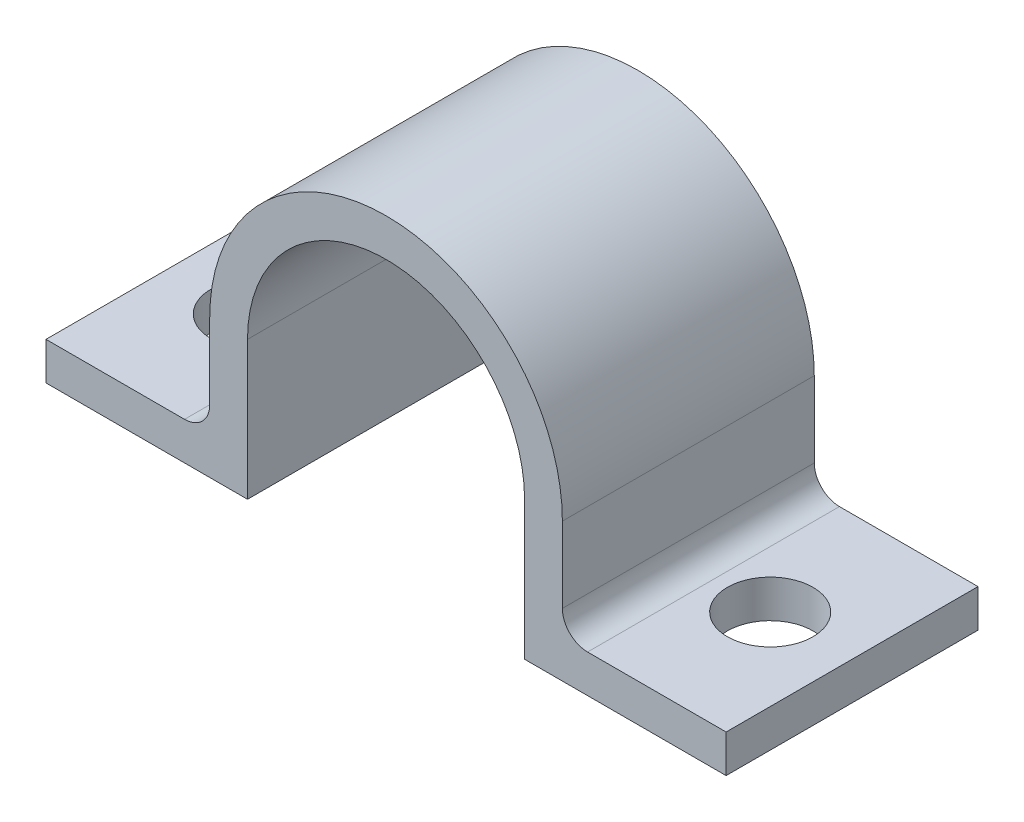
ISO-10303-21;
HEADER;
FILE_DESCRIPTION(('STEP AP214'),'2;1');
FILE_NAME('part.step','',(''),(''),'','','');
FILE_SCHEMA(('AUTOMOTIVE_DESIGN { 1 0 10303 214 1 1 1 1 }'));
ENDSEC;
DATA;
#1=APPLICATION_CONTEXT('core data for automotive mechanical design processes');
#2=APPLICATION_PROTOCOL_DEFINITION('international standard','automotive_design',2000,#1);
#3=PRODUCT_CONTEXT('',#1,'mechanical');
#4=PRODUCT('Part','Part','',(#3));
#5=PRODUCT_RELATED_PRODUCT_CATEGORY('part','',(#4));
#6=PRODUCT_DEFINITION_FORMATION('','',#4);
#7=PRODUCT_DEFINITION_CONTEXT('part definition',#1,'design');
#8=PRODUCT_DEFINITION('design','',#6,#7);
#9=PRODUCT_DEFINITION_SHAPE('','',#8);
#10=(LENGTH_UNIT() NAMED_UNIT(*) SI_UNIT(.MILLI.,.METRE.));
#11=(NAMED_UNIT(*) PLANE_ANGLE_UNIT() SI_UNIT($,.RADIAN.));
#12=(NAMED_UNIT(*) SI_UNIT($,.STERADIAN.) SOLID_ANGLE_UNIT());
#13=UNCERTAINTY_MEASURE_WITH_UNIT(LENGTH_MEASURE(1.E-05),#10,'distance_accuracy_value','');
#14=(GEOMETRIC_REPRESENTATION_CONTEXT(3) GLOBAL_UNCERTAINTY_ASSIGNED_CONTEXT((#13)) GLOBAL_UNIT_ASSIGNED_CONTEXT((#10,
#11,#12)) REPRESENTATION_CONTEXT('',''));
#15=CARTESIAN_POINT('',(0.,0.,0.));
#16=DIRECTION('',(0.,0.,1.));
#17=DIRECTION('',(1.,0.,0.));
#18=AXIS2_PLACEMENT_3D('',#15,#16,#17);
#19=CARTESIAN_POINT('',(0.,5.5,10.));
#20=DIRECTION('',(0.,0.,-1.));
#21=DIRECTION('',(-1.,0.,0.));
#22=AXIS2_PLACEMENT_3D('',#19,#20,#21);
#23=CYLINDRICAL_SURFACE('',#22,5.5);
#24=CARTESIAN_POINT('',(0.,5.5,0.));
#25=DIRECTION('',(0.,0.,-1.));
#26=DIRECTION('',(-1.,0.,0.));
#27=AXIS2_PLACEMENT_3D('',#24,#25,#26);
#28=CIRCLE('',#27,5.5);
#29=CARTESIAN_POINT('',(-5.5,5.5,0.));
#30=VERTEX_POINT('',#29);
#31=CARTESIAN_POINT('',(5.5,5.5,0.));
#32=VERTEX_POINT('',#31);
#33=EDGE_CURVE('E170',#30,#32,#28,.T.);
#34=ORIENTED_EDGE('',*,*,#33,.T.);
#35=DIRECTION('',(0.,0.,-1.));
#36=VECTOR('',#35,1.);
#37=CARTESIAN_POINT('',(5.5,5.5,10.));
#38=LINE('',#37,#36);
#39=CARTESIAN_POINT('',(5.5,5.5,10.));
#40=VERTEX_POINT('',#39);
#41=EDGE_CURVE('E149',#40,#32,#38,.T.);
#42=ORIENTED_EDGE('',*,*,#41,.F.);
#43=CARTESIAN_POINT('',(0.,5.5,10.));
#44=DIRECTION('',(0.,0.,-1.));
#45=DIRECTION('',(-1.,0.,0.));
#46=AXIS2_PLACEMENT_3D('',#43,#44,#45);
#47=CIRCLE('',#46,5.5);
#48=CARTESIAN_POINT('',(-5.5,5.5,10.));
#49=VERTEX_POINT('',#48);
#50=EDGE_CURVE('E157',#49,#40,#47,.T.);
#51=ORIENTED_EDGE('',*,*,#50,.F.);
#52=DIRECTION('',(0.,0.,-1.));
#53=VECTOR('',#52,1.);
#54=CARTESIAN_POINT('',(-5.5,5.5,10.));
#55=LINE('',#54,#53);
#56=EDGE_CURVE('E247',#49,#30,#55,.T.);
#57=ORIENTED_EDGE('',*,*,#56,.T.);
#58=EDGE_LOOP('',(#34,#42,#51,#57));
#59=FACE_BOUND('',#58,.T.);
#60=ADVANCED_FACE('F43',(#59),#23,.F.);
#61=CARTESIAN_POINT('',(5.5,0.,10.));
#62=DIRECTION('',(1.,0.,0.));
#63=DIRECTION('',(0.,1.,0.));
#64=AXIS2_PLACEMENT_3D('',#61,#62,#63);
#65=PLANE('',#64);
#66=DIRECTION('',(0.,-1.,0.));
#67=VECTOR('',#66,1.);
#68=CARTESIAN_POINT('',(5.5,0.,0.));
#69=LINE('',#68,#67);
#70=CARTESIAN_POINT('',(5.5,0.,0.));
#71=VERTEX_POINT('',#70);
#72=EDGE_CURVE('E288',#32,#71,#69,.T.);
#73=ORIENTED_EDGE('',*,*,#72,.T.);
#74=DIRECTION('',(0.,0.,-1.));
#75=VECTOR('',#74,1.);
#76=CARTESIAN_POINT('',(5.5,0.,10.));
#77=LINE('',#76,#75);
#78=CARTESIAN_POINT('',(5.5,0.,10.));
#79=VERTEX_POINT('',#78);
#80=EDGE_CURVE('E152',#79,#71,#77,.T.);
#81=ORIENTED_EDGE('',*,*,#80,.F.);
#82=DIRECTION('',(0.,-1.,0.));
#83=VECTOR('',#82,1.);
#84=CARTESIAN_POINT('',(5.5,0.,10.));
#85=LINE('',#84,#83);
#86=EDGE_CURVE('E145',#40,#79,#85,.T.);
#87=ORIENTED_EDGE('',*,*,#86,.F.);
#88=ORIENTED_EDGE('',*,*,#41,.T.);
#89=EDGE_LOOP('',(#73,#81,#87,#88));
#90=FACE_BOUND('',#89,.T.);
#91=ADVANCED_FACE('F147',(#90),#65,.F.);
#92=CARTESIAN_POINT('',(5.5,0.,10.));
#93=DIRECTION('',(0.,1.,0.));
#94=DIRECTION('',(0.,0.,1.));
#95=AXIS2_PLACEMENT_3D('',#92,#93,#94);
#96=PLANE('',#95);
#97=CARTESIAN_POINT('',(10.25,0.,5.));
#98=DIRECTION('',(0.,1.,0.));
#99=DIRECTION('',(-1.,0.,0.));
#100=AXIS2_PLACEMENT_3D('',#97,#98,#99);
#101=CIRCLE('',#100,1.7);
#102=CARTESIAN_POINT('',(8.55,0.,5.));
#103=VERTEX_POINT('',#102);
#104=EDGE_CURVE('E319',#103,#103,#101,.T.);
#105=ORIENTED_EDGE('',*,*,#104,.T.);
#106=EDGE_LOOP('',(#105));
#107=FACE_BOUND('',#106,.T.);
#108=DIRECTION('',(1.,0.,0.));
#109=VECTOR('',#108,1.);
#110=CARTESIAN_POINT('',(5.5,0.,0.));
#111=LINE('',#110,#109);
#112=CARTESIAN_POINT('',(13.5,0.,0.));
#113=VERTEX_POINT('',#112);
#114=EDGE_CURVE('E281',#71,#113,#111,.T.);
#115=ORIENTED_EDGE('',*,*,#114,.T.);
#116=DIRECTION('',(0.,0.,-1.));
#117=VECTOR('',#116,1.);
#118=CARTESIAN_POINT('',(13.5,0.,10.));
#119=LINE('',#118,#117);
#120=CARTESIAN_POINT('',(13.5,0.,10.));
#121=VERTEX_POINT('',#120);
#122=EDGE_CURVE('E179',#121,#113,#119,.T.);
#123=ORIENTED_EDGE('',*,*,#122,.F.);
#124=DIRECTION('',(1.,0.,0.));
#125=VECTOR('',#124,1.);
#126=CARTESIAN_POINT('',(5.5,0.,10.));
#127=LINE('',#126,#125);
#128=EDGE_CURVE('E156',#79,#121,#127,.T.);
#129=ORIENTED_EDGE('',*,*,#128,.F.);
#130=ORIENTED_EDGE('',*,*,#80,.T.);
#131=EDGE_LOOP('',(#115,#123,#129,#130));
#132=FACE_BOUND('',#131,.T.);
#133=ADVANCED_FACE('F321',(#107,#132),#96,.F.);
#134=CARTESIAN_POINT('',(13.5,0.,10.));
#135=DIRECTION('',(-1.,0.,0.));
#136=DIRECTION('',(0.,0.,1.));
#137=AXIS2_PLACEMENT_3D('',#134,#135,#136);
#138=PLANE('',#137);
#139=DIRECTION('',(0.,1.,0.));
#140=VECTOR('',#139,1.);
#141=CARTESIAN_POINT('',(13.5,0.,0.));
#142=LINE('',#141,#140);
#143=CARTESIAN_POINT('',(13.5,1.5,0.));
#144=VERTEX_POINT('',#143);
#145=EDGE_CURVE('E277',#113,#144,#142,.T.);
#146=ORIENTED_EDGE('',*,*,#145,.T.);
#147=DIRECTION('',(0.,0.,-1.));
#148=VECTOR('',#147,1.);
#149=CARTESIAN_POINT('',(13.5,1.5,10.));
#150=LINE('',#149,#148);
#151=CARTESIAN_POINT('',(13.5,1.5,10.));
#152=VERTEX_POINT('',#151);
#153=EDGE_CURVE('E266',#152,#144,#150,.T.);
#154=ORIENTED_EDGE('',*,*,#153,.F.);
#155=DIRECTION('',(0.,1.,0.));
#156=VECTOR('',#155,1.);
#157=CARTESIAN_POINT('',(13.5,0.,10.));
#158=LINE('',#157,#156);
#159=EDGE_CURVE('E278',#121,#152,#158,.T.);
#160=ORIENTED_EDGE('',*,*,#159,.F.);
#161=ORIENTED_EDGE('',*,*,#122,.T.);
#162=EDGE_LOOP('',(#146,#154,#160,#161));
#163=FACE_BOUND('',#162,.T.);
#164=ADVANCED_FACE('F275',(#163),#138,.F.);
#165=CARTESIAN_POINT('',(7.,1.5,10.));
#166=DIRECTION('',(0.,-1.,0.));
#167=DIRECTION('',(0.,0.,-1.));
#168=AXIS2_PLACEMENT_3D('',#165,#166,#167);
#169=PLANE('',#168);
#170=CARTESIAN_POINT('',(10.25,1.5,5.));
#171=DIRECTION('',(0.,1.,0.));
#172=DIRECTION('',(-1.,0.,0.));
#173=AXIS2_PLACEMENT_3D('',#170,#171,#172);
#174=CIRCLE('',#173,1.7);
#175=CARTESIAN_POINT('',(8.55,1.5,5.));
#176=VERTEX_POINT('',#175);
#177=EDGE_CURVE('E388',#176,#176,#174,.T.);
#178=ORIENTED_EDGE('',*,*,#177,.F.);
#179=EDGE_LOOP('',(#178));
#180=FACE_BOUND('',#179,.T.);
#181=DIRECTION('',(-1.,0.,0.));
#182=VECTOR('',#181,1.);
#183=CARTESIAN_POINT('',(7.,1.5,0.));
#184=LINE('',#183,#182);
#185=CARTESIAN_POINT('',(8.,1.5,0.));
#186=VERTEX_POINT('',#185);
#187=EDGE_CURVE('E282',#144,#186,#184,.T.);
#188=ORIENTED_EDGE('',*,*,#187,.T.);
#189=DIRECTION('',(0.,0.,-1.));
#190=VECTOR('',#189,1.);
#191=CARTESIAN_POINT('',(8.,1.5,10.));
#192=LINE('',#191,#190);
#193=CARTESIAN_POINT('',(8.,1.5,10.));
#194=VERTEX_POINT('',#193);
#195=EDGE_CURVE('E59',#186,#194,#192,.F.);
#196=ORIENTED_EDGE('',*,*,#195,.T.);
#197=DIRECTION('',(-1.,0.,0.));
#198=VECTOR('',#197,1.);
#199=CARTESIAN_POINT('',(7.,1.5,10.));
#200=LINE('',#199,#198);
#201=EDGE_CURVE('E307',#152,#194,#200,.T.);
#202=ORIENTED_EDGE('',*,*,#201,.F.);
#203=ORIENTED_EDGE('',*,*,#153,.T.);
#204=EDGE_LOOP('',(#188,#196,#202,#203));
#205=FACE_BOUND('',#204,.T.);
#206=ADVANCED_FACE('F350',(#180,#205),#169,.F.);
#207=CARTESIAN_POINT('',(7.,1.5,10.));
#208=DIRECTION('',(-1.,0.,0.));
#209=DIRECTION('',(0.,-1.,0.));
#210=AXIS2_PLACEMENT_3D('',#207,#208,#209);
#211=PLANE('',#210);
#212=DIRECTION('',(0.,1.,0.));
#213=VECTOR('',#212,1.);
#214=CARTESIAN_POINT('',(7.,1.5,10.));
#215=LINE('',#214,#213);
#216=CARTESIAN_POINT('',(7.,2.5,10.));
#217=VERTEX_POINT('',#216);
#218=CARTESIAN_POINT('',(7.,5.5,10.));
#219=VERTEX_POINT('',#218);
#220=EDGE_CURVE('E302',#217,#219,#215,.T.);
#221=ORIENTED_EDGE('',*,*,#220,.F.);
#222=DIRECTION('',(0.,0.,-1.));
#223=VECTOR('',#222,1.);
#224=CARTESIAN_POINT('',(7.,2.5,0.));
#225=LINE('',#224,#223);
#226=CARTESIAN_POINT('',(7.,2.5,0.));
#227=VERTEX_POINT('',#226);
#228=EDGE_CURVE('E185',#217,#227,#225,.T.);
#229=ORIENTED_EDGE('',*,*,#228,.T.);
#230=DIRECTION('',(0.,1.,0.));
#231=VECTOR('',#230,1.);
#232=CARTESIAN_POINT('',(7.,1.5,0.));
#233=LINE('',#232,#231);
#234=CARTESIAN_POINT('',(7.,5.5,0.));
#235=VERTEX_POINT('',#234);
#236=EDGE_CURVE('E236',#227,#235,#233,.T.);
#237=ORIENTED_EDGE('',*,*,#236,.T.);
#238=DIRECTION('',(0.,0.,-1.));
#239=VECTOR('',#238,1.);
#240=CARTESIAN_POINT('',(7.,5.5,10.));
#241=LINE('',#240,#239);
#242=EDGE_CURVE('E262',#219,#235,#241,.T.);
#243=ORIENTED_EDGE('',*,*,#242,.F.);
#244=EDGE_LOOP('',(#221,#229,#237,#243));
#245=FACE_BOUND('',#244,.T.);
#246=ADVANCED_FACE('F295',(#245),#211,.F.);
#247=CARTESIAN_POINT('',(0.,5.5,10.));
#248=DIRECTION('',(0.,0.,-1.));
#249=DIRECTION('',(-1.,0.,0.));
#250=AXIS2_PLACEMENT_3D('',#247,#248,#249);
#251=CYLINDRICAL_SURFACE('',#250,7.);
#252=CARTESIAN_POINT('',(0.,5.5,0.));
#253=DIRECTION('',(0.,0.,1.));
#254=DIRECTION('',(-1.,0.,0.));
#255=AXIS2_PLACEMENT_3D('',#252,#253,#254);
#256=CIRCLE('',#255,7.);
#257=CARTESIAN_POINT('',(-7.,5.5,0.));
#258=VERTEX_POINT('',#257);
#259=EDGE_CURVE('E230',#235,#258,#256,.T.);
#260=ORIENTED_EDGE('',*,*,#259,.T.);
#261=DIRECTION('',(0.,0.,-1.));
#262=VECTOR('',#261,1.);
#263=CARTESIAN_POINT('',(-7.,5.5,10.));
#264=LINE('',#263,#262);
#265=CARTESIAN_POINT('',(-7.,5.5,10.));
#266=VERTEX_POINT('',#265);
#267=EDGE_CURVE('E228',#266,#258,#264,.T.);
#268=ORIENTED_EDGE('',*,*,#267,.F.);
#269=CARTESIAN_POINT('',(0.,5.5,10.));
#270=DIRECTION('',(0.,0.,1.));
#271=DIRECTION('',(-1.,0.,0.));
#272=AXIS2_PLACEMENT_3D('',#269,#270,#271);
#273=CIRCLE('',#272,7.);
#274=EDGE_CURVE('E300',#219,#266,#273,.T.);
#275=ORIENTED_EDGE('',*,*,#274,.F.);
#276=ORIENTED_EDGE('',*,*,#242,.T.);
#277=EDGE_LOOP('',(#260,#268,#275,#276));
#278=FACE_BOUND('',#277,.T.);
#279=ADVANCED_FACE('F299',(#278),#251,.T.);
#280=CARTESIAN_POINT('',(-6.99999999999999,1.5,10.));
#281=DIRECTION('',(1.,0.,0.));
#282=DIRECTION('',(0.,1.,0.));
#283=AXIS2_PLACEMENT_3D('',#280,#281,#282);
#284=PLANE('',#283);
#285=DIRECTION('',(0.,-1.,0.));
#286=VECTOR('',#285,1.);
#287=CARTESIAN_POINT('',(-6.99999999999999,1.5,0.));
#288=LINE('',#287,#286);
#289=CARTESIAN_POINT('',(-7.,2.5,0.));
#290=VERTEX_POINT('',#289);
#291=EDGE_CURVE('E221',#258,#290,#288,.T.);
#292=ORIENTED_EDGE('',*,*,#291,.T.);
#293=DIRECTION('',(0.,0.,-1.));
#294=VECTOR('',#293,1.);
#295=CARTESIAN_POINT('',(-7.,2.5,10.));
#296=LINE('',#295,#294);
#297=CARTESIAN_POINT('',(-7.,2.5,10.));
#298=VERTEX_POINT('',#297);
#299=EDGE_CURVE('E177',#290,#298,#296,.F.);
#300=ORIENTED_EDGE('',*,*,#299,.T.);
#301=DIRECTION('',(0.,-1.,0.));
#302=VECTOR('',#301,1.);
#303=CARTESIAN_POINT('',(-6.99999999999999,1.5,10.));
#304=LINE('',#303,#302);
#305=EDGE_CURVE('E203',#266,#298,#304,.T.);
#306=ORIENTED_EDGE('',*,*,#305,.F.);
#307=ORIENTED_EDGE('',*,*,#267,.T.);
#308=EDGE_LOOP('',(#292,#300,#306,#307));
#309=FACE_BOUND('',#308,.T.);
#310=ADVANCED_FACE('F226',(#309),#284,.F.);
#311=CARTESIAN_POINT('',(-6.99999999999999,1.5,10.));
#312=DIRECTION('',(0.,-1.,0.));
#313=DIRECTION('',(1.,0.,0.));
#314=AXIS2_PLACEMENT_3D('',#311,#312,#313);
#315=PLANE('',#314);
#316=CARTESIAN_POINT('',(-10.25,1.5,5.));
#317=DIRECTION('',(0.,-1.,0.));
#318=DIRECTION('',(1.,0.,0.));
#319=AXIS2_PLACEMENT_3D('',#316,#317,#318);
#320=CIRCLE('',#319,1.7);
#321=CARTESIAN_POINT('',(-8.55,1.5,5.));
#322=VERTEX_POINT('',#321);
#323=EDGE_CURVE('E396',#322,#322,#320,.T.);
#324=ORIENTED_EDGE('',*,*,#323,.T.);
#325=EDGE_LOOP('',(#324));
#326=FACE_BOUND('',#325,.T.);
#327=DIRECTION('',(-1.,0.,0.));
#328=VECTOR('',#327,1.);
#329=CARTESIAN_POINT('',(-6.99999999999999,1.5,10.));
#330=LINE('',#329,#328);
#331=CARTESIAN_POINT('',(-7.99999999999999,1.5,10.));
#332=VERTEX_POINT('',#331);
#333=CARTESIAN_POINT('',(-13.5,1.5,10.));
#334=VERTEX_POINT('',#333);
#335=EDGE_CURVE('E200',#332,#334,#330,.T.);
#336=ORIENTED_EDGE('',*,*,#335,.F.);
#337=DIRECTION('',(0.,0.,-1.));
#338=VECTOR('',#337,1.);
#339=CARTESIAN_POINT('',(-7.99999999999999,1.5,0.));
#340=LINE('',#339,#338);
#341=CARTESIAN_POINT('',(-7.99999999999999,1.5,0.));
#342=VERTEX_POINT('',#341);
#343=EDGE_CURVE('E172',#332,#342,#340,.T.);
#344=ORIENTED_EDGE('',*,*,#343,.T.);
#345=DIRECTION('',(-1.,0.,0.));
#346=VECTOR('',#345,1.);
#347=CARTESIAN_POINT('',(-6.99999999999999,1.5,0.));
#348=LINE('',#347,#346);
#349=CARTESIAN_POINT('',(-13.5,1.5,0.));
#350=VERTEX_POINT('',#349);
#351=EDGE_CURVE('E223',#342,#350,#348,.T.);
#352=ORIENTED_EDGE('',*,*,#351,.T.);
#353=DIRECTION('',(0.,0.,-1.));
#354=VECTOR('',#353,1.);
#355=CARTESIAN_POINT('',(-13.5,1.5,10.));
#356=LINE('',#355,#354);
#357=EDGE_CURVE('E211',#334,#350,#356,.T.);
#358=ORIENTED_EDGE('',*,*,#357,.F.);
#359=EDGE_LOOP('',(#336,#344,#352,#358));
#360=FACE_BOUND('',#359,.T.);
#361=ADVANCED_FACE('F208',(#326,#360),#315,.F.);
#362=CARTESIAN_POINT('',(-13.5,0.,10.));
#363=DIRECTION('',(1.,0.,0.));
#364=DIRECTION('',(0.,0.,-1.));
#365=AXIS2_PLACEMENT_3D('',#362,#363,#364);
#366=PLANE('',#365);
#367=DIRECTION('',(0.,-1.,0.));
#368=VECTOR('',#367,1.);
#369=CARTESIAN_POINT('',(-13.5,0.,0.));
#370=LINE('',#369,#368);
#371=CARTESIAN_POINT('',(-13.5,0.,0.));
#372=VERTEX_POINT('',#371);
#373=EDGE_CURVE('E234',#350,#372,#370,.T.);
#374=ORIENTED_EDGE('',*,*,#373,.T.);
#375=DIRECTION('',(0.,0.,-1.));
#376=VECTOR('',#375,1.);
#377=CARTESIAN_POINT('',(-13.5,0.,10.));
#378=LINE('',#377,#376);
#379=CARTESIAN_POINT('',(-13.5,0.,10.));
#380=VERTEX_POINT('',#379);
#381=EDGE_CURVE('E254',#380,#372,#378,.T.);
#382=ORIENTED_EDGE('',*,*,#381,.F.);
#383=DIRECTION('',(0.,-1.,0.));
#384=VECTOR('',#383,1.);
#385=CARTESIAN_POINT('',(-13.5,0.,10.));
#386=LINE('',#385,#384);
#387=EDGE_CURVE('E214',#334,#380,#386,.T.);
#388=ORIENTED_EDGE('',*,*,#387,.F.);
#389=ORIENTED_EDGE('',*,*,#357,.T.);
#390=EDGE_LOOP('',(#374,#382,#388,#389));
#391=FACE_BOUND('',#390,.T.);
#392=ADVANCED_FACE('F362',(#391),#366,.F.);
#393=CARTESIAN_POINT('',(-5.49999999999999,0.,10.));
#394=DIRECTION('',(0.,1.,0.));
#395=DIRECTION('',(-1.,0.,0.));
#396=AXIS2_PLACEMENT_3D('',#393,#394,#395);
#397=PLANE('',#396);
#398=CARTESIAN_POINT('',(-10.25,0.,5.));
#399=DIRECTION('',(0.,-1.,0.));
#400=DIRECTION('',(1.,0.,0.));
#401=AXIS2_PLACEMENT_3D('',#398,#399,#400);
#402=CIRCLE('',#401,1.7);
#403=CARTESIAN_POINT('',(-8.55,0.,5.));
#404=VERTEX_POINT('',#403);
#405=EDGE_CURVE('E390',#404,#404,#402,.T.);
#406=ORIENTED_EDGE('',*,*,#405,.F.);
#407=EDGE_LOOP('',(#406));
#408=FACE_BOUND('',#407,.T.);
#409=DIRECTION('',(1.,0.,0.));
#410=VECTOR('',#409,1.);
#411=CARTESIAN_POINT('',(-5.49999999999999,0.,0.));
#412=LINE('',#411,#410);
#413=CARTESIAN_POINT('',(-5.49999999999999,0.,0.));
#414=VERTEX_POINT('',#413);
#415=EDGE_CURVE('E242',#372,#414,#412,.T.);
#416=ORIENTED_EDGE('',*,*,#415,.T.);
#417=DIRECTION('',(0.,0.,-1.));
#418=VECTOR('',#417,1.);
#419=CARTESIAN_POINT('',(-5.49999999999999,0.,10.));
#420=LINE('',#419,#418);
#421=CARTESIAN_POINT('',(-5.49999999999999,0.,10.));
#422=VERTEX_POINT('',#421);
#423=EDGE_CURVE('E250',#422,#414,#420,.T.);
#424=ORIENTED_EDGE('',*,*,#423,.F.);
#425=DIRECTION('',(1.,0.,0.));
#426=VECTOR('',#425,1.);
#427=CARTESIAN_POINT('',(-5.49999999999999,0.,10.));
#428=LINE('',#427,#426);
#429=EDGE_CURVE('E313',#380,#422,#428,.T.);
#430=ORIENTED_EDGE('',*,*,#429,.F.);
#431=ORIENTED_EDGE('',*,*,#381,.T.);
#432=EDGE_LOOP('',(#416,#424,#430,#431));
#433=FACE_BOUND('',#432,.T.);
#434=ADVANCED_FACE('F366',(#408,#433),#397,.F.);
#435=CARTESIAN_POINT('',(-5.49999999999999,0.,10.));
#436=DIRECTION('',(-1.,0.,0.));
#437=DIRECTION('',(0.,-1.,0.));
#438=AXIS2_PLACEMENT_3D('',#435,#436,#437);
#439=PLANE('',#438);
#440=DIRECTION('',(0.,1.,0.));
#441=VECTOR('',#440,1.);
#442=CARTESIAN_POINT('',(-5.49999999999999,0.,0.));
#443=LINE('',#442,#441);
#444=EDGE_CURVE('E167',#414,#30,#443,.T.);
#445=ORIENTED_EDGE('',*,*,#444,.T.);
#446=ORIENTED_EDGE('',*,*,#56,.F.);
#447=DIRECTION('',(0.,1.,0.));
#448=VECTOR('',#447,1.);
#449=CARTESIAN_POINT('',(-5.49999999999999,0.,10.));
#450=LINE('',#449,#448);
#451=EDGE_CURVE('E162',#422,#49,#450,.T.);
#452=ORIENTED_EDGE('',*,*,#451,.F.);
#453=ORIENTED_EDGE('',*,*,#423,.T.);
#454=EDGE_LOOP('',(#445,#446,#452,#453));
#455=FACE_BOUND('',#454,.T.);
#456=ADVANCED_FACE('F370',(#455),#439,.F.);
#457=CARTESIAN_POINT('',(0.,5.5,10.));
#458=DIRECTION('',(0.,0.,-1.));
#459=DIRECTION('',(-1.,0.,0.));
#460=AXIS2_PLACEMENT_3D('',#457,#458,#459);
#461=PLANE('',#460);
#462=ORIENTED_EDGE('',*,*,#50,.T.);
#463=ORIENTED_EDGE('',*,*,#86,.T.);
#464=ORIENTED_EDGE('',*,*,#128,.T.);
#465=ORIENTED_EDGE('',*,*,#159,.T.);
#466=ORIENTED_EDGE('',*,*,#201,.T.);
#467=CARTESIAN_POINT('',(8.,2.5,10.));
#468=DIRECTION('',(0.,0.,-1.));
#469=DIRECTION('',(-1.,0.,0.));
#470=AXIS2_PLACEMENT_3D('',#467,#468,#469);
#471=CIRCLE('',#470,1.);
#472=EDGE_CURVE('E11',#194,#217,#471,.T.);
#473=ORIENTED_EDGE('',*,*,#472,.T.);
#474=ORIENTED_EDGE('',*,*,#220,.T.);
#475=ORIENTED_EDGE('',*,*,#274,.T.);
#476=ORIENTED_EDGE('',*,*,#305,.T.);
#477=CARTESIAN_POINT('',(-7.99999999999999,2.5,10.));
#478=DIRECTION('',(0.,0.,-1.));
#479=DIRECTION('',(-1.,0.,0.));
#480=AXIS2_PLACEMENT_3D('',#477,#478,#479);
#481=CIRCLE('',#480,1.);
#482=EDGE_CURVE('E194',#298,#332,#481,.T.);
#483=ORIENTED_EDGE('',*,*,#482,.T.);
#484=ORIENTED_EDGE('',*,*,#335,.T.);
#485=ORIENTED_EDGE('',*,*,#387,.T.);
#486=ORIENTED_EDGE('',*,*,#429,.T.);
#487=ORIENTED_EDGE('',*,*,#451,.T.);
#488=EDGE_LOOP('',(#462,#463,#464,#465,#466,#473,#474,#475,#476,#483,#484,#485,#486,#487));
#489=FACE_BOUND('',#488,.T.);
#490=ADVANCED_FACE('F160',(#489),#461,.F.);
#491=CARTESIAN_POINT('',(0.,5.5,0.));
#492=DIRECTION('',(0.,0.,-1.));
#493=DIRECTION('',(-1.,0.,0.));
#494=AXIS2_PLACEMENT_3D('',#491,#492,#493);
#495=PLANE('',#494);
#496=ORIENTED_EDGE('',*,*,#33,.F.);
#497=ORIENTED_EDGE('',*,*,#444,.F.);
#498=ORIENTED_EDGE('',*,*,#415,.F.);
#499=ORIENTED_EDGE('',*,*,#373,.F.);
#500=ORIENTED_EDGE('',*,*,#351,.F.);
#501=CARTESIAN_POINT('',(-7.99999999999999,2.5,0.));
#502=DIRECTION('',(0.,0.,-1.));
#503=DIRECTION('',(-1.,0.,0.));
#504=AXIS2_PLACEMENT_3D('',#501,#502,#503);
#505=CIRCLE('',#504,1.);
#506=EDGE_CURVE('E191',#342,#290,#505,.F.);
#507=ORIENTED_EDGE('',*,*,#506,.T.);
#508=ORIENTED_EDGE('',*,*,#291,.F.);
#509=ORIENTED_EDGE('',*,*,#259,.F.);
#510=ORIENTED_EDGE('',*,*,#236,.F.);
#511=CARTESIAN_POINT('',(8.,2.5,0.));
#512=DIRECTION('',(0.,0.,-1.));
#513=DIRECTION('',(-1.,0.,0.));
#514=AXIS2_PLACEMENT_3D('',#511,#512,#513);
#515=CIRCLE('',#514,1.);
#516=EDGE_CURVE('E52',#227,#186,#515,.F.);
#517=ORIENTED_EDGE('',*,*,#516,.T.);
#518=ORIENTED_EDGE('',*,*,#187,.F.);
#519=ORIENTED_EDGE('',*,*,#145,.F.);
#520=ORIENTED_EDGE('',*,*,#114,.F.);
#521=ORIENTED_EDGE('',*,*,#72,.F.);
#522=EDGE_LOOP('',(#496,#497,#498,#499,#500,#507,#508,#509,#510,#517,#518,#519,#520,#521));
#523=FACE_BOUND('',#522,.T.);
#524=ADVANCED_FACE('F219',(#523),#495,.T.);
#525=CARTESIAN_POINT('',(10.25,0.,5.));
#526=DIRECTION('',(0.,1.,0.));
#527=DIRECTION('',(-1.,0.,0.));
#528=AXIS2_PLACEMENT_3D('',#525,#526,#527);
#529=CYLINDRICAL_SURFACE('',#528,1.7);
#530=ORIENTED_EDGE('',*,*,#104,.F.);
#531=EDGE_LOOP('',(#530));
#532=FACE_BOUND('',#531,.T.);
#533=ORIENTED_EDGE('',*,*,#177,.T.);
#534=EDGE_LOOP('',(#533));
#535=FACE_BOUND('',#534,.T.);
#536=ADVANCED_FACE('F337',(#532,#535),#529,.F.);
#537=CARTESIAN_POINT('',(-7.99999999999999,2.5,10.));
#538=DIRECTION('',(0.,0.,1.));
#539=DIRECTION('',(1.,0.,0.));
#540=AXIS2_PLACEMENT_3D('',#537,#538,#539);
#541=CYLINDRICAL_SURFACE('',#540,1.);
#542=ORIENTED_EDGE('',*,*,#482,.F.);
#543=ORIENTED_EDGE('',*,*,#299,.F.);
#544=ORIENTED_EDGE('',*,*,#506,.F.);
#545=ORIENTED_EDGE('',*,*,#343,.F.);
#546=EDGE_LOOP('',(#542,#543,#544,#545));
#547=FACE_BOUND('',#546,.T.);
#548=ADVANCED_FACE('F216',(#547),#541,.F.);
#549=CARTESIAN_POINT('',(8.,2.5,10.));
#550=DIRECTION('',(0.,0.,1.));
#551=DIRECTION('',(1.,0.,0.));
#552=AXIS2_PLACEMENT_3D('',#549,#550,#551);
#553=CYLINDRICAL_SURFACE('',#552,1.);
#554=ORIENTED_EDGE('',*,*,#472,.F.);
#555=ORIENTED_EDGE('',*,*,#195,.F.);
#556=ORIENTED_EDGE('',*,*,#516,.F.);
#557=ORIENTED_EDGE('',*,*,#228,.F.);
#558=EDGE_LOOP('',(#554,#555,#556,#557));
#559=FACE_BOUND('',#558,.T.);
#560=ADVANCED_FACE('F45',(#559),#553,.F.);
#561=CARTESIAN_POINT('',(-10.25,0.,5.));
#562=DIRECTION('',(0.,1.,0.));
#563=DIRECTION('',(-1.,0.,0.));
#564=AXIS2_PLACEMENT_3D('',#561,#562,#563);
#565=CYLINDRICAL_SURFACE('',#564,1.7);
#566=ORIENTED_EDGE('',*,*,#405,.T.);
#567=EDGE_LOOP('',(#566));
#568=FACE_BOUND('',#567,.T.);
#569=ORIENTED_EDGE('',*,*,#323,.F.);
#570=EDGE_LOOP('',(#569));
#571=FACE_BOUND('',#570,.T.);
#572=ADVANCED_FACE('F330',(#568,#571),#565,.F.);
#573=CLOSED_SHELL('',(#60,#91,#133,#164,#206,#246,#279,#310,#361,#392,#434,#456,#490,#524,#536,
#548,#560,#572));
#574=MANIFOLD_SOLID_BREP('B2',#573);
#575=ADVANCED_BREP_SHAPE_REPRESENTATION('',(#18,#574),#14);
#576=SHAPE_DEFINITION_REPRESENTATION(#9,#575);
ENDSEC;
END-ISO-10303-21;
